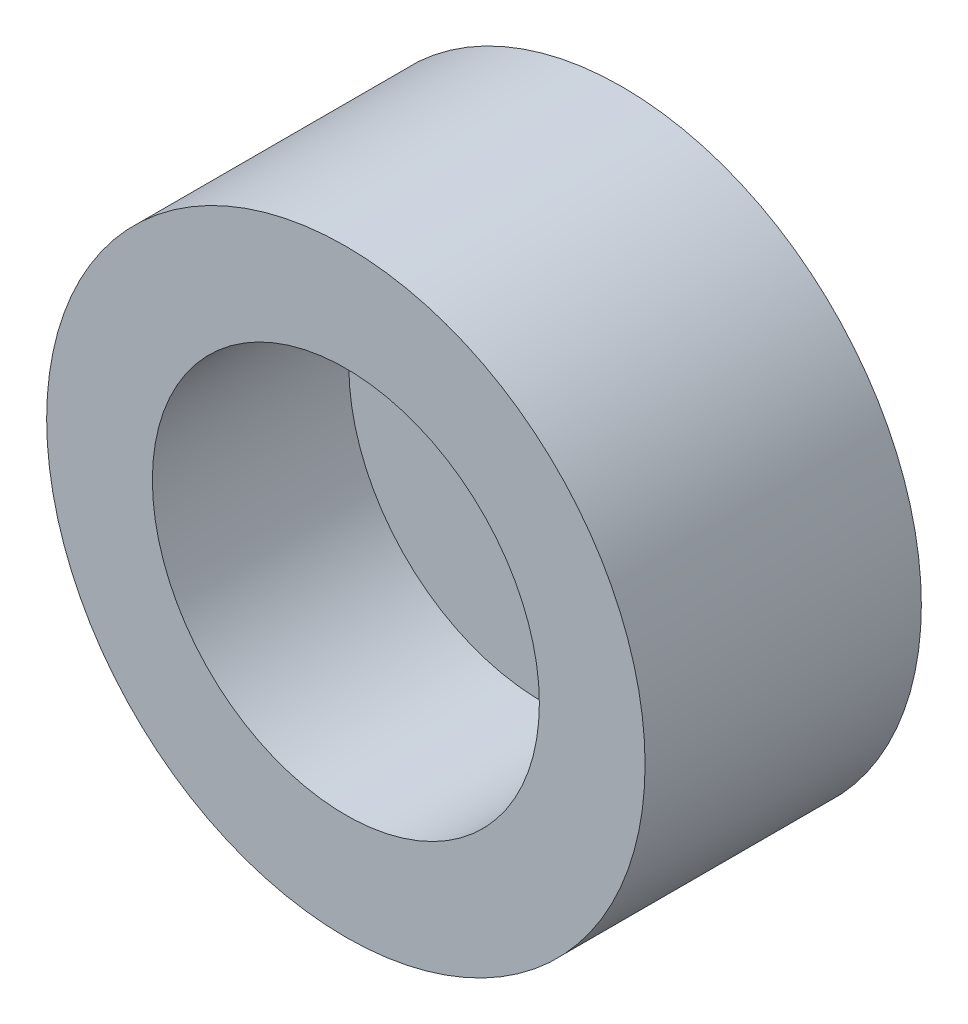
ISO-10303-21;
HEADER;
FILE_DESCRIPTION(('STEP AP214'),'2;1');
FILE_NAME('part.step','',(''),(''),'','','');
FILE_SCHEMA(('AUTOMOTIVE_DESIGN { 1 0 10303 214 1 1 1 1 }'));
ENDSEC;
DATA;
#1=APPLICATION_CONTEXT('core data for automotive mechanical design processes');
#2=APPLICATION_PROTOCOL_DEFINITION('international standard','automotive_design',2000,#1);
#3=PRODUCT_CONTEXT('',#1,'mechanical');
#4=PRODUCT('Part','Part','',(#3));
#5=PRODUCT_RELATED_PRODUCT_CATEGORY('part','',(#4));
#6=PRODUCT_DEFINITION_FORMATION('','',#4);
#7=PRODUCT_DEFINITION_CONTEXT('part definition',#1,'design');
#8=PRODUCT_DEFINITION('design','',#6,#7);
#9=PRODUCT_DEFINITION_SHAPE('','',#8);
#10=(LENGTH_UNIT() NAMED_UNIT(*) SI_UNIT(.MILLI.,.METRE.));
#11=(NAMED_UNIT(*) PLANE_ANGLE_UNIT() SI_UNIT($,.RADIAN.));
#12=(NAMED_UNIT(*) SI_UNIT($,.STERADIAN.) SOLID_ANGLE_UNIT());
#13=UNCERTAINTY_MEASURE_WITH_UNIT(LENGTH_MEASURE(1.E-05),#10,'distance_accuracy_value','');
#14=(GEOMETRIC_REPRESENTATION_CONTEXT(3) GLOBAL_UNCERTAINTY_ASSIGNED_CONTEXT((#13)) GLOBAL_UNIT_ASSIGNED_CONTEXT((#10,
#11,#12)) REPRESENTATION_CONTEXT('',''));
#15=CARTESIAN_POINT('',(0.,0.,0.));
#16=DIRECTION('',(0.,0.,1.));
#17=DIRECTION('',(1.,0.,0.));
#18=AXIS2_PLACEMENT_3D('',#15,#16,#17);
#19=CARTESIAN_POINT('',(0.,0.,2.));
#20=DIRECTION('',(0.,0.,-1.));
#21=DIRECTION('',(-1.,0.,0.));
#22=AXIS2_PLACEMENT_3D('',#19,#20,#21);
#23=CYLINDRICAL_SURFACE('',#22,7.5);
#24=CARTESIAN_POINT('',(0.,0.,0.));
#25=DIRECTION('',(0.,0.,1.));
#26=DIRECTION('',(1.,0.,0.));
#27=AXIS2_PLACEMENT_3D('',#24,#25,#26);
#28=CIRCLE('',#27,7.5);
#29=CARTESIAN_POINT('',(7.5,0.,0.));
#30=VERTEX_POINT('',#29);
#31=EDGE_CURVE('E48',#30,#30,#28,.T.);
#32=ORIENTED_EDGE('',*,*,#31,.T.);
#33=EDGE_LOOP('',(#32));
#34=FACE_BOUND('',#33,.T.);
#35=CARTESIAN_POINT('',(0.,0.,6.925));
#36=DIRECTION('',(0.,0.,1.));
#37=DIRECTION('',(1.,0.,0.));
#38=AXIS2_PLACEMENT_3D('',#35,#36,#37);
#39=CIRCLE('',#38,7.5);
#40=CARTESIAN_POINT('',(7.5,0.,6.925));
#41=VERTEX_POINT('',#40);
#42=EDGE_CURVE('E53',#41,#41,#39,.T.);
#43=ORIENTED_EDGE('',*,*,#42,.F.);
#44=EDGE_LOOP('',(#43));
#45=FACE_BOUND('',#44,.T.);
#46=ADVANCED_FACE('F41',(#34,#45),#23,.T.);
#47=CARTESIAN_POINT('',(0.,0.,0.));
#48=DIRECTION('',(0.,0.,1.));
#49=DIRECTION('',(1.,0.,0.));
#50=AXIS2_PLACEMENT_3D('',#47,#48,#49);
#51=PLANE('',#50);
#52=ORIENTED_EDGE('',*,*,#31,.F.);
#53=EDGE_LOOP('',(#52));
#54=FACE_BOUND('',#53,.T.);
#55=ADVANCED_FACE('F69',(#54),#51,.F.);
#56=CARTESIAN_POINT('',(0.,0.,6.925));
#57=DIRECTION('',(0.,0.,1.));
#58=DIRECTION('',(1.,0.,0.));
#59=AXIS2_PLACEMENT_3D('',#56,#57,#58);
#60=PLANE('',#59);
#61=ORIENTED_EDGE('',*,*,#42,.T.);
#62=EDGE_LOOP('',(#61));
#63=FACE_BOUND('',#62,.T.);
#64=CARTESIAN_POINT('',(0.,0.,6.925));
#65=DIRECTION('',(0.,0.,1.));
#66=DIRECTION('',(1.,0.,0.));
#67=AXIS2_PLACEMENT_3D('',#64,#65,#66);
#68=CIRCLE('',#67,4.85);
#69=CARTESIAN_POINT('',(4.85,0.,6.925));
#70=VERTEX_POINT('',#69);
#71=EDGE_CURVE('E58',#70,#70,#68,.T.);
#72=ORIENTED_EDGE('',*,*,#71,.F.);
#73=EDGE_LOOP('',(#72));
#74=FACE_BOUND('',#73,.T.);
#75=ADVANCED_FACE('F67',(#63,#74),#60,.T.);
#76=CARTESIAN_POINT('',(0.,0.,6.925));
#77=DIRECTION('',(0.,0.,-1.));
#78=DIRECTION('',(-1.,0.,0.));
#79=AXIS2_PLACEMENT_3D('',#76,#77,#78);
#80=CYLINDRICAL_SURFACE('',#79,4.85);
#81=ORIENTED_EDGE('',*,*,#71,.T.);
#82=EDGE_LOOP('',(#81));
#83=FACE_BOUND('',#82,.T.);
#84=CARTESIAN_POINT('',(0.,0.,2.));
#85=DIRECTION('',(0.,0.,1.));
#86=DIRECTION('',(1.,0.,0.));
#87=AXIS2_PLACEMENT_3D('',#84,#85,#86);
#88=CIRCLE('',#87,4.85);
#89=CARTESIAN_POINT('',(4.85,0.,2.));
#90=VERTEX_POINT('',#89);
#91=EDGE_CURVE('E10',#90,#90,#88,.F.);
#92=ORIENTED_EDGE('',*,*,#91,.T.);
#93=EDGE_LOOP('',(#92));
#94=FACE_BOUND('',#93,.T.);
#95=ADVANCED_FACE('F65',(#83,#94),#80,.F.);
#96=CARTESIAN_POINT('',(0.,0.,2.));
#97=DIRECTION('',(0.,0.,1.));
#98=DIRECTION('',(1.,0.,0.));
#99=AXIS2_PLACEMENT_3D('',#96,#97,#98);
#100=PLANE('',#99);
#101=ORIENTED_EDGE('',*,*,#91,.F.);
#102=EDGE_LOOP('',(#101));
#103=FACE_BOUND('',#102,.T.);
#104=ADVANCED_FACE('F76',(#103),#100,.T.);
#105=CLOSED_SHELL('',(#46,#55,#75,#95,#104));
#106=MANIFOLD_SOLID_BREP('B2',#105);
#107=ADVANCED_BREP_SHAPE_REPRESENTATION('',(#18,#106),#14);
#108=SHAPE_DEFINITION_REPRESENTATION(#9,#107);
ENDSEC;
END-ISO-10303-21;
